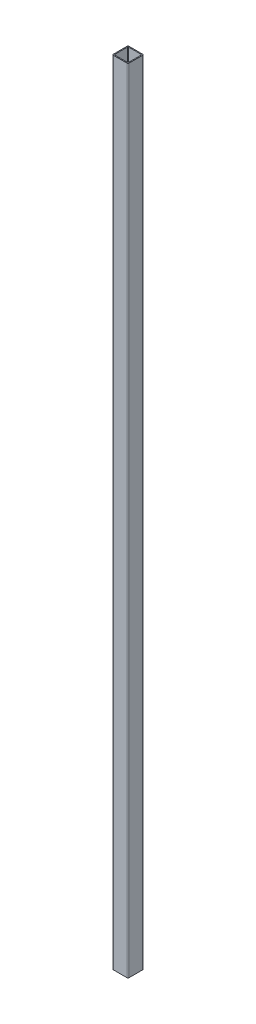
ISO-10303-21;
HEADER;
FILE_DESCRIPTION(('STEP AP214'),'2;1');
FILE_NAME('part.step','',(''),(''),'','','');
FILE_SCHEMA(('AUTOMOTIVE_DESIGN { 1 0 10303 214 1 1 1 1 }'));
ENDSEC;
DATA;
#1=APPLICATION_CONTEXT('core data for automotive mechanical design processes');
#2=APPLICATION_PROTOCOL_DEFINITION('international standard','automotive_design',2000,#1);
#3=PRODUCT_CONTEXT('',#1,'mechanical');
#4=PRODUCT('Part','Part','',(#3));
#5=PRODUCT_RELATED_PRODUCT_CATEGORY('part','',(#4));
#6=PRODUCT_DEFINITION_FORMATION('','',#4);
#7=PRODUCT_DEFINITION_CONTEXT('part definition',#1,'design');
#8=PRODUCT_DEFINITION('design','',#6,#7);
#9=PRODUCT_DEFINITION_SHAPE('','',#8);
#10=(LENGTH_UNIT() NAMED_UNIT(*) SI_UNIT(.MILLI.,.METRE.));
#11=(NAMED_UNIT(*) PLANE_ANGLE_UNIT() SI_UNIT($,.RADIAN.));
#12=(NAMED_UNIT(*) SI_UNIT($,.STERADIAN.) SOLID_ANGLE_UNIT());
#13=UNCERTAINTY_MEASURE_WITH_UNIT(LENGTH_MEASURE(1.E-05),#10,'distance_accuracy_value','');
#14=(GEOMETRIC_REPRESENTATION_CONTEXT(3) GLOBAL_UNCERTAINTY_ASSIGNED_CONTEXT((#13)) GLOBAL_UNIT_ASSIGNED_CONTEXT((#10,
#11,#12)) REPRESENTATION_CONTEXT('',''));
#15=CARTESIAN_POINT('',(0.,0.,0.));
#16=DIRECTION('',(0.,0.,1.));
#17=DIRECTION('',(1.,0.,0.));
#18=AXIS2_PLACEMENT_3D('',#15,#16,#17);
#19=CARTESIAN_POINT('',(5056.,5060.,94.0000000000006));
#20=DIRECTION('',(0.,1.,0.));
#21=DIRECTION('',(0.,0.,1.));
#22=AXIS2_PLACEMENT_3D('',#19,#20,#21);
#23=PLANE('',#22);
#24=CARTESIAN_POINT('',(5056.,5060.,94.0000000000006));
#25=DIRECTION('',(0.,1.,0.));
#26=DIRECTION('',(0.,0.,1.));
#27=AXIS2_PLACEMENT_3D('',#24,#25,#26);
#28=CIRCLE('',#27,6.00000000000014);
#29=CARTESIAN_POINT('',(5050.,5060.,94.0000000000006));
#30=VERTEX_POINT('',#29);
#31=CARTESIAN_POINT('',(5056.,5060.,100.000000000001));
#32=VERTEX_POINT('',#31);
#33=EDGE_CURVE('E213',#30,#32,#28,.T.);
#34=ORIENTED_EDGE('',*,*,#33,.T.);
#35=DIRECTION('',(1.,0.,0.));
#36=VECTOR('',#35,1.);
#37=CARTESIAN_POINT('',(5056.,5060.,100.000000000001));
#38=LINE('',#37,#36);
#39=CARTESIAN_POINT('',(5144.,5060.,100.000000000001));
#40=VERTEX_POINT('',#39);
#41=EDGE_CURVE('E216',#32,#40,#38,.T.);
#42=ORIENTED_EDGE('',*,*,#41,.T.);
#43=CARTESIAN_POINT('',(5144.,5060.,94.0000000000006));
#44=DIRECTION('',(0.,1.,0.));
#45=DIRECTION('',(0.,0.,1.));
#46=AXIS2_PLACEMENT_3D('',#43,#44,#45);
#47=CIRCLE('',#46,6.00000000000014);
#48=CARTESIAN_POINT('',(5150.,5060.,94.0000000000006));
#49=VERTEX_POINT('',#48);
#50=EDGE_CURVE('E219',#40,#49,#47,.T.);
#51=ORIENTED_EDGE('',*,*,#50,.T.);
#52=DIRECTION('',(0.,0.,-1.));
#53=VECTOR('',#52,1.);
#54=CARTESIAN_POINT('',(5150.,5060.,6.00000000000062));
#55=LINE('',#54,#53);
#56=CARTESIAN_POINT('',(5150.,5060.,6.00000000000062));
#57=VERTEX_POINT('',#56);
#58=EDGE_CURVE('E221',#49,#57,#55,.T.);
#59=ORIENTED_EDGE('',*,*,#58,.T.);
#60=CARTESIAN_POINT('',(5144.,5060.,6.00000000000062));
#61=DIRECTION('',(0.,1.,0.));
#62=DIRECTION('',(0.,0.,-1.));
#63=AXIS2_PLACEMENT_3D('',#60,#61,#62);
#64=CIRCLE('',#63,6.00000000000014);
#65=CARTESIAN_POINT('',(5144.,5060.,5.55111512312578E-13));
#66=VERTEX_POINT('',#65);
#67=EDGE_CURVE('E223',#57,#66,#64,.T.);
#68=ORIENTED_EDGE('',*,*,#67,.T.);
#69=DIRECTION('',(-1.,0.,0.));
#70=VECTOR('',#69,1.);
#71=CARTESIAN_POINT('',(5056.,5060.,5.55111512312578E-13));
#72=LINE('',#71,#70);
#73=CARTESIAN_POINT('',(5056.,5060.,4.71844785465692E-13));
#74=VERTEX_POINT('',#73);
#75=EDGE_CURVE('E225',#66,#74,#72,.T.);
#76=ORIENTED_EDGE('',*,*,#75,.T.);
#77=CARTESIAN_POINT('',(5056.,5060.,6.00000000000062));
#78=DIRECTION('',(0.,1.,0.));
#79=DIRECTION('',(0.,0.,1.));
#80=AXIS2_PLACEMENT_3D('',#77,#78,#79);
#81=CIRCLE('',#80,6.00000000000014);
#82=CARTESIAN_POINT('',(5050.,5060.,6.00000000000062));
#83=VERTEX_POINT('',#82);
#84=EDGE_CURVE('E227',#74,#83,#81,.T.);
#85=ORIENTED_EDGE('',*,*,#84,.T.);
#86=DIRECTION('',(0.,0.,1.));
#87=VECTOR('',#86,1.);
#88=CARTESIAN_POINT('',(5050.,5060.,6.00000000000062));
#89=LINE('',#88,#87);
#90=EDGE_CURVE('E229',#83,#30,#89,.T.);
#91=ORIENTED_EDGE('',*,*,#90,.T.);
#92=EDGE_LOOP('',(#34,#42,#51,#59,#68,#76,#85,#91));
#93=FACE_BOUND('',#92,.T.);
#94=DIRECTION('',(1.,0.,0.));
#95=VECTOR('',#94,1.);
#96=CARTESIAN_POINT('',(5060.,5060.,94.0000000000006));
#97=LINE('',#96,#95);
#98=CARTESIAN_POINT('',(5060.,5060.,94.0000000000006));
#99=VERTEX_POINT('',#98);
#100=CARTESIAN_POINT('',(5140.,5060.,94.0000000000004));
#101=VERTEX_POINT('',#100);
#102=EDGE_CURVE('E156',#99,#101,#97,.T.);
#103=ORIENTED_EDGE('',*,*,#102,.F.);
#104=CARTESIAN_POINT('',(5060.,5060.,90.0000000000006));
#105=DIRECTION('',(0.,1.,0.));
#106=DIRECTION('',(0.,0.,1.));
#107=AXIS2_PLACEMENT_3D('',#104,#105,#106);
#108=CIRCLE('',#107,3.99999999999978);
#109=CARTESIAN_POINT('',(5056.,5060.,90.0000000000006));
#110=VERTEX_POINT('',#109);
#111=EDGE_CURVE('E148',#110,#99,#108,.T.);
#112=ORIENTED_EDGE('',*,*,#111,.F.);
#113=DIRECTION('',(0.,0.,1.));
#114=VECTOR('',#113,1.);
#115=CARTESIAN_POINT('',(5056.,5060.,10.0000000000006));
#116=LINE('',#115,#114);
#117=CARTESIAN_POINT('',(5056.,5060.,10.0000000000006));
#118=VERTEX_POINT('',#117);
#119=EDGE_CURVE('E181',#118,#110,#116,.T.);
#120=ORIENTED_EDGE('',*,*,#119,.F.);
#121=CARTESIAN_POINT('',(5060.,5060.,10.0000000000006));
#122=DIRECTION('',(0.,1.,0.));
#123=DIRECTION('',(0.,0.,1.));
#124=AXIS2_PLACEMENT_3D('',#121,#122,#123);
#125=CIRCLE('',#124,3.99999999999978);
#126=CARTESIAN_POINT('',(5060.,5060.,6.00000000000084));
#127=VERTEX_POINT('',#126);
#128=EDGE_CURVE('E179',#127,#118,#125,.T.);
#129=ORIENTED_EDGE('',*,*,#128,.F.);
#130=DIRECTION('',(-1.,0.,0.));
#131=VECTOR('',#130,1.);
#132=CARTESIAN_POINT('',(5060.,5060.,6.00000000000062));
#133=LINE('',#132,#131);
#134=CARTESIAN_POINT('',(5140.,5060.,6.00000000000062));
#135=VERTEX_POINT('',#134);
#136=EDGE_CURVE('E177',#135,#127,#133,.T.);
#137=ORIENTED_EDGE('',*,*,#136,.F.);
#138=CARTESIAN_POINT('',(5140.,5060.,10.0000000000006));
#139=DIRECTION('',(0.,1.,0.));
#140=DIRECTION('',(0.,0.,-1.));
#141=AXIS2_PLACEMENT_3D('',#138,#139,#140);
#142=CIRCLE('',#141,3.99999999999978);
#143=CARTESIAN_POINT('',(5144.,5060.,10.0000000000006));
#144=VERTEX_POINT('',#143);
#145=EDGE_CURVE('E175',#144,#135,#142,.T.);
#146=ORIENTED_EDGE('',*,*,#145,.F.);
#147=DIRECTION('',(0.,0.,-1.));
#148=VECTOR('',#147,1.);
#149=CARTESIAN_POINT('',(5144.,5060.,10.0000000000006));
#150=LINE('',#149,#148);
#151=CARTESIAN_POINT('',(5144.,5060.,90.0000000000006));
#152=VERTEX_POINT('',#151);
#153=EDGE_CURVE('E171',#152,#144,#150,.T.);
#154=ORIENTED_EDGE('',*,*,#153,.F.);
#155=CARTESIAN_POINT('',(5140.,5060.,90.0000000000006));
#156=DIRECTION('',(0.,1.,0.));
#157=DIRECTION('',(0.,0.,1.));
#158=AXIS2_PLACEMENT_3D('',#155,#156,#157);
#159=CIRCLE('',#158,3.99999999999978);
#160=EDGE_CURVE('E169',#101,#152,#159,.T.);
#161=ORIENTED_EDGE('',*,*,#160,.F.);
#162=EDGE_LOOP('',(#103,#112,#120,#129,#137,#146,#154,#161));
#163=FACE_BOUND('',#162,.T.);
#164=ADVANCED_FACE('F35',(#93,#163),#23,.T.);
#165=CARTESIAN_POINT('',(5056.,0.,94.0000000000006));
#166=DIRECTION('',(0.,1.,0.));
#167=DIRECTION('',(0.,0.,1.));
#168=AXIS2_PLACEMENT_3D('',#165,#166,#167);
#169=PLANE('',#168);
#170=CARTESIAN_POINT('',(5056.,0.,94.0000000000006));
#171=DIRECTION('',(0.,1.,0.));
#172=DIRECTION('',(0.,0.,1.));
#173=AXIS2_PLACEMENT_3D('',#170,#171,#172);
#174=CIRCLE('',#173,6.00000000000014);
#175=CARTESIAN_POINT('',(5050.,0.,94.0000000000006));
#176=VERTEX_POINT('',#175);
#177=CARTESIAN_POINT('',(5056.,0.,100.000000000001));
#178=VERTEX_POINT('',#177);
#179=EDGE_CURVE('E164',#176,#178,#174,.T.);
#180=ORIENTED_EDGE('',*,*,#179,.F.);
#181=DIRECTION('',(0.,0.,1.));
#182=VECTOR('',#181,1.);
#183=CARTESIAN_POINT('',(5050.,0.,6.00000000000062));
#184=LINE('',#183,#182);
#185=CARTESIAN_POINT('',(5050.,0.,6.00000000000062));
#186=VERTEX_POINT('',#185);
#187=EDGE_CURVE('E217',#186,#176,#184,.T.);
#188=ORIENTED_EDGE('',*,*,#187,.F.);
#189=CARTESIAN_POINT('',(5056.,0.,6.00000000000062));
#190=DIRECTION('',(0.,1.,0.));
#191=DIRECTION('',(0.,0.,1.));
#192=AXIS2_PLACEMENT_3D('',#189,#190,#191);
#193=CIRCLE('',#192,6.00000000000014);
#194=CARTESIAN_POINT('',(5056.,0.,4.71844785465692E-13));
#195=VERTEX_POINT('',#194);
#196=EDGE_CURVE('E244',#195,#186,#193,.T.);
#197=ORIENTED_EDGE('',*,*,#196,.F.);
#198=DIRECTION('',(-1.,0.,0.));
#199=VECTOR('',#198,1.);
#200=CARTESIAN_POINT('',(5056.,0.,5.55111512312578E-13));
#201=LINE('',#200,#199);
#202=CARTESIAN_POINT('',(5144.,0.,5.55111512312578E-13));
#203=VERTEX_POINT('',#202);
#204=EDGE_CURVE('E242',#203,#195,#201,.T.);
#205=ORIENTED_EDGE('',*,*,#204,.F.);
#206=CARTESIAN_POINT('',(5144.,0.,6.00000000000062));
#207=DIRECTION('',(0.,1.,0.));
#208=DIRECTION('',(0.,0.,-1.));
#209=AXIS2_PLACEMENT_3D('',#206,#207,#208);
#210=CIRCLE('',#209,6.00000000000014);
#211=CARTESIAN_POINT('',(5150.,0.,6.00000000000062));
#212=VERTEX_POINT('',#211);
#213=EDGE_CURVE('E240',#212,#203,#210,.T.);
#214=ORIENTED_EDGE('',*,*,#213,.F.);
#215=DIRECTION('',(0.,0.,-1.));
#216=VECTOR('',#215,1.);
#217=CARTESIAN_POINT('',(5150.,0.,6.00000000000062));
#218=LINE('',#217,#216);
#219=CARTESIAN_POINT('',(5150.,0.,94.0000000000006));
#220=VERTEX_POINT('',#219);
#221=EDGE_CURVE('E238',#220,#212,#218,.T.);
#222=ORIENTED_EDGE('',*,*,#221,.F.);
#223=CARTESIAN_POINT('',(5144.,0.,94.0000000000006));
#224=DIRECTION('',(0.,1.,0.));
#225=DIRECTION('',(0.,0.,1.));
#226=AXIS2_PLACEMENT_3D('',#223,#224,#225);
#227=CIRCLE('',#226,6.00000000000014);
#228=CARTESIAN_POINT('',(5144.,0.,100.000000000001));
#229=VERTEX_POINT('',#228);
#230=EDGE_CURVE('E236',#229,#220,#227,.T.);
#231=ORIENTED_EDGE('',*,*,#230,.F.);
#232=DIRECTION('',(1.,0.,0.));
#233=VECTOR('',#232,1.);
#234=CARTESIAN_POINT('',(5056.,0.,100.000000000001));
#235=LINE('',#234,#233);
#236=EDGE_CURVE('E234',#178,#229,#235,.T.);
#237=ORIENTED_EDGE('',*,*,#236,.F.);
#238=EDGE_LOOP('',(#180,#188,#197,#205,#214,#222,#231,#237));
#239=FACE_BOUND('',#238,.T.);
#240=CARTESIAN_POINT('',(5060.,0.,90.0000000000006));
#241=DIRECTION('',(0.,1.,0.));
#242=DIRECTION('',(0.,0.,1.));
#243=AXIS2_PLACEMENT_3D('',#240,#241,#242);
#244=CIRCLE('',#243,3.99999999999978);
#245=CARTESIAN_POINT('',(5056.,0.,90.0000000000006));
#246=VERTEX_POINT('',#245);
#247=CARTESIAN_POINT('',(5060.,0.,94.0000000000006));
#248=VERTEX_POINT('',#247);
#249=EDGE_CURVE('E58',#246,#248,#244,.T.);
#250=ORIENTED_EDGE('',*,*,#249,.T.);
#251=DIRECTION('',(1.,0.,0.));
#252=VECTOR('',#251,1.);
#253=CARTESIAN_POINT('',(5060.,0.,94.0000000000006));
#254=LINE('',#253,#252);
#255=CARTESIAN_POINT('',(5140.,0.,94.0000000000004));
#256=VERTEX_POINT('',#255);
#257=EDGE_CURVE('E163',#248,#256,#254,.T.);
#258=ORIENTED_EDGE('',*,*,#257,.T.);
#259=CARTESIAN_POINT('',(5140.,0.,90.0000000000006));
#260=DIRECTION('',(0.,1.,0.));
#261=DIRECTION('',(0.,0.,1.));
#262=AXIS2_PLACEMENT_3D('',#259,#260,#261);
#263=CIRCLE('',#262,3.99999999999978);
#264=CARTESIAN_POINT('',(5144.,0.,90.0000000000006));
#265=VERTEX_POINT('',#264);
#266=EDGE_CURVE('E185',#256,#265,#263,.T.);
#267=ORIENTED_EDGE('',*,*,#266,.T.);
#268=DIRECTION('',(0.,0.,-1.));
#269=VECTOR('',#268,1.);
#270=CARTESIAN_POINT('',(5144.,0.,10.0000000000006));
#271=LINE('',#270,#269);
#272=CARTESIAN_POINT('',(5144.,0.,10.0000000000006));
#273=VERTEX_POINT('',#272);
#274=EDGE_CURVE('E188',#265,#273,#271,.T.);
#275=ORIENTED_EDGE('',*,*,#274,.T.);
#276=CARTESIAN_POINT('',(5140.,0.,10.0000000000006));
#277=DIRECTION('',(0.,1.,0.));
#278=DIRECTION('',(0.,0.,-1.));
#279=AXIS2_PLACEMENT_3D('',#276,#277,#278);
#280=CIRCLE('',#279,3.99999999999978);
#281=CARTESIAN_POINT('',(5140.,0.,6.00000000000062));
#282=VERTEX_POINT('',#281);
#283=EDGE_CURVE('E191',#273,#282,#280,.T.);
#284=ORIENTED_EDGE('',*,*,#283,.T.);
#285=DIRECTION('',(-1.,0.,0.));
#286=VECTOR('',#285,1.);
#287=CARTESIAN_POINT('',(5060.,0.,6.00000000000062));
#288=LINE('',#287,#286);
#289=CARTESIAN_POINT('',(5060.,0.,6.00000000000084));
#290=VERTEX_POINT('',#289);
#291=EDGE_CURVE('E194',#282,#290,#288,.T.);
#292=ORIENTED_EDGE('',*,*,#291,.T.);
#293=CARTESIAN_POINT('',(5060.,0.,10.0000000000006));
#294=DIRECTION('',(0.,1.,0.));
#295=DIRECTION('',(0.,0.,1.));
#296=AXIS2_PLACEMENT_3D('',#293,#294,#295);
#297=CIRCLE('',#296,3.99999999999978);
#298=CARTESIAN_POINT('',(5056.,0.,10.0000000000006));
#299=VERTEX_POINT('',#298);
#300=EDGE_CURVE('E197',#290,#299,#297,.T.);
#301=ORIENTED_EDGE('',*,*,#300,.T.);
#302=DIRECTION('',(0.,0.,1.));
#303=VECTOR('',#302,1.);
#304=CARTESIAN_POINT('',(5056.,0.,10.0000000000006));
#305=LINE('',#304,#303);
#306=EDGE_CURVE('E157',#299,#246,#305,.T.);
#307=ORIENTED_EDGE('',*,*,#306,.T.);
#308=EDGE_LOOP('',(#250,#258,#267,#275,#284,#292,#301,#307));
#309=FACE_BOUND('',#308,.T.);
#310=ADVANCED_FACE('F274',(#239,#309),#169,.F.);
#311=CARTESIAN_POINT('',(5056.,5060.,94.0000000000006));
#312=DIRECTION('',(0.,-1.,0.));
#313=DIRECTION('',(0.,0.,-1.));
#314=AXIS2_PLACEMENT_3D('',#311,#312,#313);
#315=CYLINDRICAL_SURFACE('',#314,6.00000000000014);
#316=ORIENTED_EDGE('',*,*,#179,.T.);
#317=DIRECTION('',(0.,-1.,0.));
#318=VECTOR('',#317,1.);
#319=CARTESIAN_POINT('',(5056.,5060.,100.000000000001));
#320=LINE('',#319,#318);
#321=EDGE_CURVE('E11',#32,#178,#320,.T.);
#322=ORIENTED_EDGE('',*,*,#321,.F.);
#323=ORIENTED_EDGE('',*,*,#33,.F.);
#324=DIRECTION('',(0.,-1.,0.));
#325=VECTOR('',#324,1.);
#326=CARTESIAN_POINT('',(5050.,5060.,94.0000000000006));
#327=LINE('',#326,#325);
#328=EDGE_CURVE('E231',#30,#176,#327,.T.);
#329=ORIENTED_EDGE('',*,*,#328,.T.);
#330=EDGE_LOOP('',(#316,#322,#323,#329));
#331=FACE_BOUND('',#330,.T.);
#332=ADVANCED_FACE('F37',(#331),#315,.T.);
#333=CARTESIAN_POINT('',(5056.,5060.,100.000000000001));
#334=DIRECTION('',(0.,0.,-1.));
#335=DIRECTION('',(-1.,0.,0.));
#336=AXIS2_PLACEMENT_3D('',#333,#334,#335);
#337=PLANE('',#336);
#338=ORIENTED_EDGE('',*,*,#236,.T.);
#339=DIRECTION('',(0.,-1.,0.));
#340=VECTOR('',#339,1.);
#341=CARTESIAN_POINT('',(5144.,5060.,100.000000000001));
#342=LINE('',#341,#340);
#343=EDGE_CURVE('E43',#40,#229,#342,.T.);
#344=ORIENTED_EDGE('',*,*,#343,.F.);
#345=ORIENTED_EDGE('',*,*,#41,.F.);
#346=ORIENTED_EDGE('',*,*,#321,.T.);
#347=EDGE_LOOP('',(#338,#344,#345,#346));
#348=FACE_BOUND('',#347,.T.);
#349=ADVANCED_FACE('F291',(#348),#337,.F.);
#350=CARTESIAN_POINT('',(5144.,5060.,94.0000000000006));
#351=DIRECTION('',(0.,-1.,0.));
#352=DIRECTION('',(0.,0.,-1.));
#353=AXIS2_PLACEMENT_3D('',#350,#351,#352);
#354=CYLINDRICAL_SURFACE('',#353,6.00000000000014);
#355=ORIENTED_EDGE('',*,*,#230,.T.);
#356=DIRECTION('',(0.,-1.,0.));
#357=VECTOR('',#356,1.);
#358=CARTESIAN_POINT('',(5150.,5060.,94.0000000000006));
#359=LINE('',#358,#357);
#360=EDGE_CURVE('E261',#49,#220,#359,.T.);
#361=ORIENTED_EDGE('',*,*,#360,.F.);
#362=ORIENTED_EDGE('',*,*,#50,.F.);
#363=ORIENTED_EDGE('',*,*,#343,.T.);
#364=EDGE_LOOP('',(#355,#361,#362,#363));
#365=FACE_BOUND('',#364,.T.);
#366=ADVANCED_FACE('F268',(#365),#354,.T.);
#367=CARTESIAN_POINT('',(5150.,5060.,6.00000000000062));
#368=DIRECTION('',(-1.,0.,0.));
#369=DIRECTION('',(0.,0.,1.));
#370=AXIS2_PLACEMENT_3D('',#367,#368,#369);
#371=PLANE('',#370);
#372=ORIENTED_EDGE('',*,*,#221,.T.);
#373=DIRECTION('',(0.,-1.,0.));
#374=VECTOR('',#373,1.);
#375=CARTESIAN_POINT('',(5150.,5060.,6.00000000000062));
#376=LINE('',#375,#374);
#377=EDGE_CURVE('E258',#57,#212,#376,.T.);
#378=ORIENTED_EDGE('',*,*,#377,.F.);
#379=ORIENTED_EDGE('',*,*,#58,.F.);
#380=ORIENTED_EDGE('',*,*,#360,.T.);
#381=EDGE_LOOP('',(#372,#378,#379,#380));
#382=FACE_BOUND('',#381,.T.);
#383=ADVANCED_FACE('F280',(#382),#371,.F.);
#384=CARTESIAN_POINT('',(5144.,5060.,6.00000000000062));
#385=DIRECTION('',(0.,-1.,0.));
#386=DIRECTION('',(0.,0.,-1.));
#387=AXIS2_PLACEMENT_3D('',#384,#385,#386);
#388=CYLINDRICAL_SURFACE('',#387,6.00000000000014);
#389=ORIENTED_EDGE('',*,*,#213,.T.);
#390=DIRECTION('',(0.,-1.,0.));
#391=VECTOR('',#390,1.);
#392=CARTESIAN_POINT('',(5144.,5060.,5.55111512312578E-13));
#393=LINE('',#392,#391);
#394=EDGE_CURVE('E255',#66,#203,#393,.T.);
#395=ORIENTED_EDGE('',*,*,#394,.F.);
#396=ORIENTED_EDGE('',*,*,#67,.F.);
#397=ORIENTED_EDGE('',*,*,#377,.T.);
#398=EDGE_LOOP('',(#389,#395,#396,#397));
#399=FACE_BOUND('',#398,.T.);
#400=ADVANCED_FACE('F284',(#399),#388,.T.);
#401=CARTESIAN_POINT('',(5056.,5060.,5.55111512312578E-13));
#402=DIRECTION('',(0.,0.,1.));
#403=DIRECTION('',(1.,0.,0.));
#404=AXIS2_PLACEMENT_3D('',#401,#402,#403);
#405=PLANE('',#404);
#406=ORIENTED_EDGE('',*,*,#204,.T.);
#407=DIRECTION('',(0.,-1.,0.));
#408=VECTOR('',#407,1.);
#409=CARTESIAN_POINT('',(5056.,5060.,4.71844785465692E-13));
#410=LINE('',#409,#408);
#411=EDGE_CURVE('E252',#74,#195,#410,.T.);
#412=ORIENTED_EDGE('',*,*,#411,.F.);
#413=ORIENTED_EDGE('',*,*,#75,.F.);
#414=ORIENTED_EDGE('',*,*,#394,.T.);
#415=EDGE_LOOP('',(#406,#412,#413,#414));
#416=FACE_BOUND('',#415,.T.);
#417=ADVANCED_FACE('F304',(#416),#405,.F.);
#418=CARTESIAN_POINT('',(5056.,5060.,6.00000000000062));
#419=DIRECTION('',(0.,-1.,0.));
#420=DIRECTION('',(0.,0.,-1.));
#421=AXIS2_PLACEMENT_3D('',#418,#419,#420);
#422=CYLINDRICAL_SURFACE('',#421,6.00000000000014);
#423=ORIENTED_EDGE('',*,*,#196,.T.);
#424=DIRECTION('',(0.,-1.,0.));
#425=VECTOR('',#424,1.);
#426=CARTESIAN_POINT('',(5050.,5060.,6.00000000000062));
#427=LINE('',#426,#425);
#428=EDGE_CURVE('E249',#83,#186,#427,.T.);
#429=ORIENTED_EDGE('',*,*,#428,.F.);
#430=ORIENTED_EDGE('',*,*,#84,.F.);
#431=ORIENTED_EDGE('',*,*,#411,.T.);
#432=EDGE_LOOP('',(#423,#429,#430,#431));
#433=FACE_BOUND('',#432,.T.);
#434=ADVANCED_FACE('F302',(#433),#422,.T.);
#435=CARTESIAN_POINT('',(5050.,5060.,6.00000000000062));
#436=DIRECTION('',(1.,0.,0.));
#437=DIRECTION('',(0.,0.,-1.));
#438=AXIS2_PLACEMENT_3D('',#435,#436,#437);
#439=PLANE('',#438);
#440=ORIENTED_EDGE('',*,*,#187,.T.);
#441=ORIENTED_EDGE('',*,*,#328,.F.);
#442=ORIENTED_EDGE('',*,*,#90,.F.);
#443=ORIENTED_EDGE('',*,*,#428,.T.);
#444=EDGE_LOOP('',(#440,#441,#442,#443));
#445=FACE_BOUND('',#444,.T.);
#446=ADVANCED_FACE('F297',(#445),#439,.F.);
#447=CARTESIAN_POINT('',(5060.,5060.,90.0000000000006));
#448=DIRECTION('',(0.,-1.,0.));
#449=DIRECTION('',(0.,0.,-1.));
#450=AXIS2_PLACEMENT_3D('',#447,#448,#449);
#451=CYLINDRICAL_SURFACE('',#450,3.99999999999978);
#452=ORIENTED_EDGE('',*,*,#249,.F.);
#453=DIRECTION('',(0.,-1.,0.));
#454=VECTOR('',#453,1.);
#455=CARTESIAN_POINT('',(5056.,5060.,90.0000000000006));
#456=LINE('',#455,#454);
#457=EDGE_CURVE('E152',#110,#246,#456,.T.);
#458=ORIENTED_EDGE('',*,*,#457,.F.);
#459=ORIENTED_EDGE('',*,*,#111,.T.);
#460=DIRECTION('',(0.,-1.,0.));
#461=VECTOR('',#460,1.);
#462=CARTESIAN_POINT('',(5060.,5060.,94.0000000000006));
#463=LINE('',#462,#461);
#464=EDGE_CURVE('E151',#99,#248,#463,.T.);
#465=ORIENTED_EDGE('',*,*,#464,.T.);
#466=EDGE_LOOP('',(#452,#458,#459,#465));
#467=FACE_BOUND('',#466,.T.);
#468=ADVANCED_FACE('F150',(#467),#451,.F.);
#469=CARTESIAN_POINT('',(5060.,5060.,94.0000000000006));
#470=DIRECTION('',(0.,0.,-1.));
#471=DIRECTION('',(-1.,0.,0.));
#472=AXIS2_PLACEMENT_3D('',#469,#470,#471);
#473=PLANE('',#472);
#474=ORIENTED_EDGE('',*,*,#257,.F.);
#475=ORIENTED_EDGE('',*,*,#464,.F.);
#476=ORIENTED_EDGE('',*,*,#102,.T.);
#477=DIRECTION('',(0.,-1.,0.));
#478=VECTOR('',#477,1.);
#479=CARTESIAN_POINT('',(5140.,5060.,94.0000000000004));
#480=LINE('',#479,#478);
#481=EDGE_CURVE('E165',#101,#256,#480,.T.);
#482=ORIENTED_EDGE('',*,*,#481,.T.);
#483=EDGE_LOOP('',(#474,#475,#476,#482));
#484=FACE_BOUND('',#483,.T.);
#485=ADVANCED_FACE('F160',(#484),#473,.T.);
#486=CARTESIAN_POINT('',(5140.,5060.,90.0000000000006));
#487=DIRECTION('',(0.,-1.,0.));
#488=DIRECTION('',(0.,0.,-1.));
#489=AXIS2_PLACEMENT_3D('',#486,#487,#488);
#490=CYLINDRICAL_SURFACE('',#489,3.99999999999978);
#491=ORIENTED_EDGE('',*,*,#266,.F.);
#492=ORIENTED_EDGE('',*,*,#481,.F.);
#493=ORIENTED_EDGE('',*,*,#160,.T.);
#494=DIRECTION('',(0.,-1.,0.));
#495=VECTOR('',#494,1.);
#496=CARTESIAN_POINT('',(5144.,5060.,90.0000000000006));
#497=LINE('',#496,#495);
#498=EDGE_CURVE('E210',#152,#265,#497,.T.);
#499=ORIENTED_EDGE('',*,*,#498,.T.);
#500=EDGE_LOOP('',(#491,#492,#493,#499));
#501=FACE_BOUND('',#500,.T.);
#502=ADVANCED_FACE('F329',(#501),#490,.F.);
#503=CARTESIAN_POINT('',(5144.,5060.,10.0000000000006));
#504=DIRECTION('',(-1.,0.,0.));
#505=DIRECTION('',(0.,0.,1.));
#506=AXIS2_PLACEMENT_3D('',#503,#504,#505);
#507=PLANE('',#506);
#508=ORIENTED_EDGE('',*,*,#274,.F.);
#509=ORIENTED_EDGE('',*,*,#498,.F.);
#510=ORIENTED_EDGE('',*,*,#153,.T.);
#511=DIRECTION('',(0.,-1.,0.));
#512=VECTOR('',#511,1.);
#513=CARTESIAN_POINT('',(5144.,5060.,10.0000000000006));
#514=LINE('',#513,#512);
#515=EDGE_CURVE('E208',#144,#273,#514,.T.);
#516=ORIENTED_EDGE('',*,*,#515,.T.);
#517=EDGE_LOOP('',(#508,#509,#510,#516));
#518=FACE_BOUND('',#517,.T.);
#519=ADVANCED_FACE('F333',(#518),#507,.T.);
#520=CARTESIAN_POINT('',(5140.,5060.,10.0000000000006));
#521=DIRECTION('',(0.,-1.,0.));
#522=DIRECTION('',(0.,0.,-1.));
#523=AXIS2_PLACEMENT_3D('',#520,#521,#522);
#524=CYLINDRICAL_SURFACE('',#523,3.99999999999978);
#525=ORIENTED_EDGE('',*,*,#283,.F.);
#526=ORIENTED_EDGE('',*,*,#515,.F.);
#527=ORIENTED_EDGE('',*,*,#145,.T.);
#528=DIRECTION('',(0.,-1.,0.));
#529=VECTOR('',#528,1.);
#530=CARTESIAN_POINT('',(5140.,5060.,6.00000000000062));
#531=LINE('',#530,#529);
#532=EDGE_CURVE('E206',#135,#282,#531,.T.);
#533=ORIENTED_EDGE('',*,*,#532,.T.);
#534=EDGE_LOOP('',(#525,#526,#527,#533));
#535=FACE_BOUND('',#534,.T.);
#536=ADVANCED_FACE('F339',(#535),#524,.F.);
#537=CARTESIAN_POINT('',(5060.,5060.,6.00000000000062));
#538=DIRECTION('',(0.,0.,1.));
#539=DIRECTION('',(1.,0.,0.));
#540=AXIS2_PLACEMENT_3D('',#537,#538,#539);
#541=PLANE('',#540);
#542=ORIENTED_EDGE('',*,*,#291,.F.);
#543=ORIENTED_EDGE('',*,*,#532,.F.);
#544=ORIENTED_EDGE('',*,*,#136,.T.);
#545=DIRECTION('',(0.,-1.,0.));
#546=VECTOR('',#545,1.);
#547=CARTESIAN_POINT('',(5060.,5060.,6.00000000000084));
#548=LINE('',#547,#546);
#549=EDGE_CURVE('E204',#127,#290,#548,.T.);
#550=ORIENTED_EDGE('',*,*,#549,.T.);
#551=EDGE_LOOP('',(#542,#543,#544,#550));
#552=FACE_BOUND('',#551,.T.);
#553=ADVANCED_FACE('F343',(#552),#541,.T.);
#554=CARTESIAN_POINT('',(5060.,5060.,10.0000000000006));
#555=DIRECTION('',(0.,-1.,0.));
#556=DIRECTION('',(0.,0.,-1.));
#557=AXIS2_PLACEMENT_3D('',#554,#555,#556);
#558=CYLINDRICAL_SURFACE('',#557,3.99999999999978);
#559=ORIENTED_EDGE('',*,*,#300,.F.);
#560=ORIENTED_EDGE('',*,*,#549,.F.);
#561=ORIENTED_EDGE('',*,*,#128,.T.);
#562=DIRECTION('',(0.,-1.,0.));
#563=VECTOR('',#562,1.);
#564=CARTESIAN_POINT('',(5056.,5060.,10.0000000000006));
#565=LINE('',#564,#563);
#566=EDGE_CURVE('E50',#118,#299,#565,.T.);
#567=ORIENTED_EDGE('',*,*,#566,.T.);
#568=EDGE_LOOP('',(#559,#560,#561,#567));
#569=FACE_BOUND('',#568,.T.);
#570=ADVANCED_FACE('F347',(#569),#558,.F.);
#571=CARTESIAN_POINT('',(5056.,5060.,10.0000000000006));
#572=DIRECTION('',(1.,0.,0.));
#573=DIRECTION('',(0.,0.,-1.));
#574=AXIS2_PLACEMENT_3D('',#571,#572,#573);
#575=PLANE('',#574);
#576=ORIENTED_EDGE('',*,*,#306,.F.);
#577=ORIENTED_EDGE('',*,*,#566,.F.);
#578=ORIENTED_EDGE('',*,*,#119,.T.);
#579=ORIENTED_EDGE('',*,*,#457,.T.);
#580=EDGE_LOOP('',(#576,#577,#578,#579));
#581=FACE_BOUND('',#580,.T.);
#582=ADVANCED_FACE('F351',(#581),#575,.T.);
#583=CLOSED_SHELL('',(#164,#310,#332,#349,#366,#383,#400,#417,#434,#446,#468,#485,#502,#519,
#536,#553,#570,#582));
#584=MANIFOLD_SOLID_BREP('B2',#583);
#585=ADVANCED_BREP_SHAPE_REPRESENTATION('',(#18,#584),#14);
#586=SHAPE_DEFINITION_REPRESENTATION(#9,#585);
ENDSEC;
END-ISO-10303-21;
